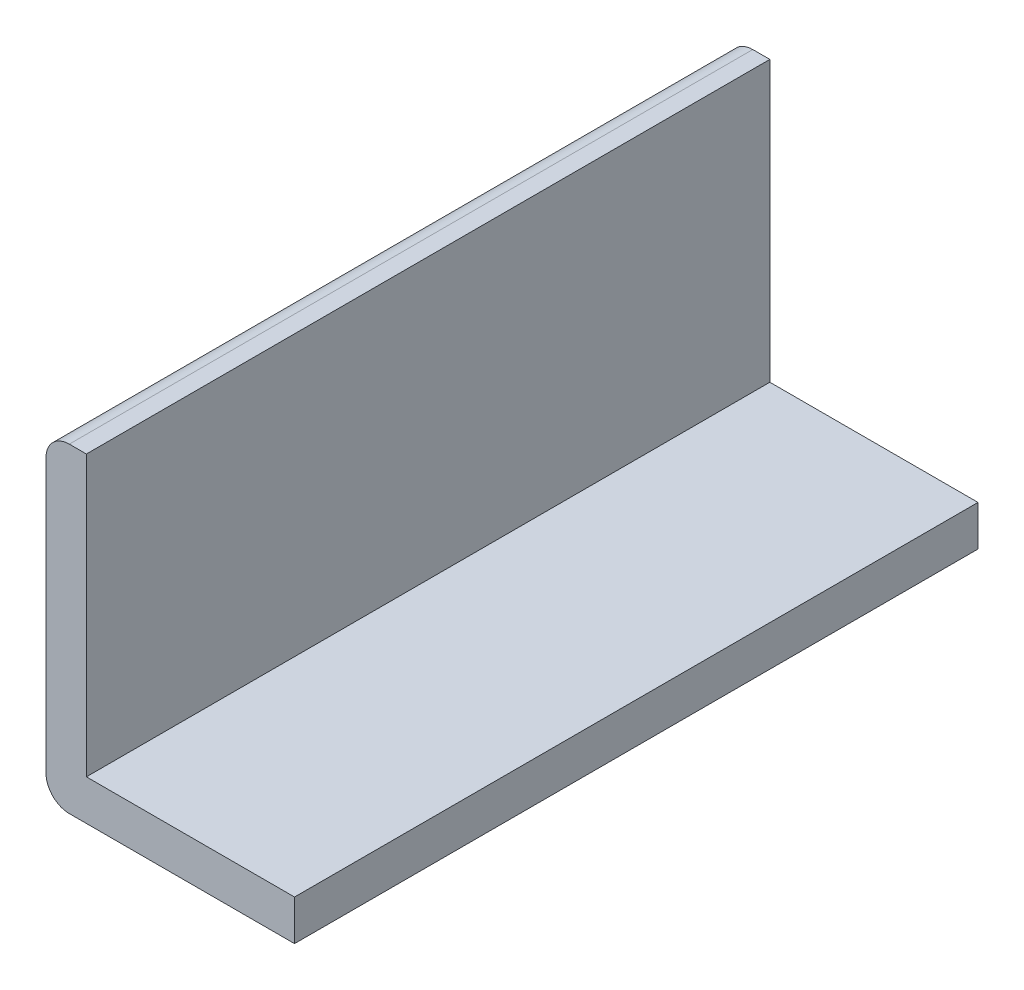
ISO-10303-21;
HEADER;
FILE_DESCRIPTION(('STEP AP214'),'2;1');
FILE_NAME('part.step','',(''),(''),'','','');
FILE_SCHEMA(('AUTOMOTIVE_DESIGN { 1 0 10303 214 1 1 1 1 }'));
ENDSEC;
DATA;
#1=APPLICATION_CONTEXT('core data for automotive mechanical design processes');
#2=APPLICATION_PROTOCOL_DEFINITION('international standard','automotive_design',2000,#1);
#3=PRODUCT_CONTEXT('',#1,'mechanical');
#4=PRODUCT('Part','Part','',(#3));
#5=PRODUCT_RELATED_PRODUCT_CATEGORY('part','',(#4));
#6=PRODUCT_DEFINITION_FORMATION('','',#4);
#7=PRODUCT_DEFINITION_CONTEXT('part definition',#1,'design');
#8=PRODUCT_DEFINITION('design','',#6,#7);
#9=PRODUCT_DEFINITION_SHAPE('','',#8);
#10=(LENGTH_UNIT() NAMED_UNIT(*) SI_UNIT(.MILLI.,.METRE.));
#11=(NAMED_UNIT(*) PLANE_ANGLE_UNIT() SI_UNIT($,.RADIAN.));
#12=(NAMED_UNIT(*) SI_UNIT($,.STERADIAN.) SOLID_ANGLE_UNIT());
#13=UNCERTAINTY_MEASURE_WITH_UNIT(LENGTH_MEASURE(1.E-05),#10,'distance_accuracy_value','');
#14=(GEOMETRIC_REPRESENTATION_CONTEXT(3) GLOBAL_UNCERTAINTY_ASSIGNED_CONTEXT((#13)) GLOBAL_UNIT_ASSIGNED_CONTEXT((#10,
#11,#12)) REPRESENTATION_CONTEXT('',''));
#15=CARTESIAN_POINT('',(0.,0.,0.));
#16=DIRECTION('',(0.,0.,1.));
#17=DIRECTION('',(1.,0.,0.));
#18=AXIS2_PLACEMENT_3D('',#15,#16,#17);
#19=CARTESIAN_POINT('',(0.075,0.075,0.));
#20=DIRECTION('',(0.,0.,-1.));
#21=DIRECTION('',(-1.,0.,0.));
#22=AXIS2_PLACEMENT_3D('',#19,#20,#21);
#23=CYLINDRICAL_SURFACE('',#22,0.075);
#24=CARTESIAN_POINT('',(0.075,0.075,0.));
#25=DIRECTION('',(0.,0.,-1.));
#26=DIRECTION('',(-1.,0.,0.));
#27=AXIS2_PLACEMENT_3D('',#24,#25,#26);
#28=CIRCLE('',#27,0.075);
#29=CARTESIAN_POINT('',(0.075,0.,0.));
#30=VERTEX_POINT('',#29);
#31=CARTESIAN_POINT('',(0.,0.075,0.));
#32=VERTEX_POINT('',#31);
#33=EDGE_CURVE('E89',#30,#32,#28,.T.);
#34=ORIENTED_EDGE('',*,*,#33,.T.);
#35=DIRECTION('',(0.,0.,-1.));
#36=VECTOR('',#35,1.);
#37=CARTESIAN_POINT('',(0.,0.075,0.));
#38=LINE('',#37,#36);
#39=CARTESIAN_POINT('',(0.,0.075,-2.2));
#40=VERTEX_POINT('',#39);
#41=EDGE_CURVE('E93',#32,#40,#38,.T.);
#42=ORIENTED_EDGE('',*,*,#41,.T.);
#43=CARTESIAN_POINT('',(0.075,0.075,-2.2));
#44=DIRECTION('',(0.,0.,-1.));
#45=DIRECTION('',(-1.,0.,0.));
#46=AXIS2_PLACEMENT_3D('',#43,#44,#45);
#47=CIRCLE('',#46,0.075);
#48=CARTESIAN_POINT('',(0.075,0.,-2.2));
#49=VERTEX_POINT('',#48);
#50=EDGE_CURVE('E20',#40,#49,#47,.F.);
#51=ORIENTED_EDGE('',*,*,#50,.T.);
#52=DIRECTION('',(0.,0.,-1.));
#53=VECTOR('',#52,1.);
#54=CARTESIAN_POINT('',(0.075,0.,0.));
#55=LINE('',#54,#53);
#56=EDGE_CURVE('E112',#30,#49,#55,.T.);
#57=ORIENTED_EDGE('',*,*,#56,.F.);
#58=EDGE_LOOP('',(#34,#42,#51,#57));
#59=FACE_BOUND('',#58,.T.);
#60=ADVANCED_FACE('F17',(#59),#23,.T.);
#61=CARTESIAN_POINT('',(0.,1.03,0.));
#62=DIRECTION('',(1.,0.,0.));
#63=DIRECTION('',(0.,0.,-1.));
#64=AXIS2_PLACEMENT_3D('',#61,#62,#63);
#65=PLANE('',#64);
#66=DIRECTION('',(0.,0.,1.));
#67=VECTOR('',#66,1.);
#68=CARTESIAN_POINT('',(0.,0.955,0.));
#69=LINE('',#68,#67);
#70=CARTESIAN_POINT('',(0.,0.955,-2.2));
#71=VERTEX_POINT('',#70);
#72=CARTESIAN_POINT('',(0.,0.955,0.));
#73=VERTEX_POINT('',#72);
#74=EDGE_CURVE('E96',#71,#73,#69,.T.);
#75=ORIENTED_EDGE('',*,*,#74,.F.);
#76=DIRECTION('',(0.,1.,0.));
#77=VECTOR('',#76,1.);
#78=CARTESIAN_POINT('',(0.,1.03,-2.2));
#79=LINE('',#78,#77);
#80=EDGE_CURVE('E81',#40,#71,#79,.T.);
#81=ORIENTED_EDGE('',*,*,#80,.F.);
#82=ORIENTED_EDGE('',*,*,#41,.F.);
#83=DIRECTION('',(0.,1.,0.));
#84=VECTOR('',#83,1.);
#85=CARTESIAN_POINT('',(0.,1.03,0.));
#86=LINE('',#85,#84);
#87=EDGE_CURVE('E97',#73,#32,#86,.F.);
#88=ORIENTED_EDGE('',*,*,#87,.F.);
#89=EDGE_LOOP('',(#75,#81,#82,#88));
#90=FACE_BOUND('',#89,.T.);
#91=ADVANCED_FACE('F92',(#90),#65,.F.);
#92=CARTESIAN_POINT('',(0.,0.,0.));
#93=DIRECTION('',(0.,-1.,0.));
#94=DIRECTION('',(0.,0.,-1.));
#95=AXIS2_PLACEMENT_3D('',#92,#93,#94);
#96=PLANE('',#95);
#97=DIRECTION('',(1.,0.,0.));
#98=VECTOR('',#97,1.);
#99=CARTESIAN_POINT('',(0.,0.,-2.2));
#100=LINE('',#99,#98);
#101=CARTESIAN_POINT('',(0.8,0.,-2.2));
#102=VERTEX_POINT('',#101);
#103=EDGE_CURVE('E84',#49,#102,#100,.T.);
#104=ORIENTED_EDGE('',*,*,#103,.T.);
#105=DIRECTION('',(0.,0.,1.));
#106=VECTOR('',#105,1.);
#107=CARTESIAN_POINT('',(0.8,0.,0.));
#108=LINE('',#107,#106);
#109=CARTESIAN_POINT('',(0.8,0.,0.));
#110=VERTEX_POINT('',#109);
#111=EDGE_CURVE('E107',#102,#110,#108,.T.);
#112=ORIENTED_EDGE('',*,*,#111,.T.);
#113=DIRECTION('',(1.,0.,0.));
#114=VECTOR('',#113,1.);
#115=CARTESIAN_POINT('',(0.,0.,0.));
#116=LINE('',#115,#114);
#117=EDGE_CURVE('E117',#110,#30,#116,.F.);
#118=ORIENTED_EDGE('',*,*,#117,.T.);
#119=ORIENTED_EDGE('',*,*,#56,.T.);
#120=EDGE_LOOP('',(#104,#112,#118,#119));
#121=FACE_BOUND('',#120,.T.);
#122=ADVANCED_FACE('F201',(#121),#96,.T.);
#123=CARTESIAN_POINT('',(0.075,0.955,0.));
#124=DIRECTION('',(0.,0.,1.));
#125=DIRECTION('',(1.,0.,0.));
#126=AXIS2_PLACEMENT_3D('',#123,#124,#125);
#127=CYLINDRICAL_SURFACE('',#126,0.075);
#128=CARTESIAN_POINT('',(0.075,0.955,0.));
#129=DIRECTION('',(0.,0.,1.));
#130=DIRECTION('',(1.,0.,0.));
#131=AXIS2_PLACEMENT_3D('',#128,#129,#130);
#132=CIRCLE('',#131,0.075);
#133=CARTESIAN_POINT('',(0.075,1.03,0.));
#134=VERTEX_POINT('',#133);
#135=EDGE_CURVE('E105',#73,#134,#132,.F.);
#136=ORIENTED_EDGE('',*,*,#135,.T.);
#137=DIRECTION('',(0.,0.,-1.));
#138=VECTOR('',#137,1.);
#139=CARTESIAN_POINT('',(0.075,1.03,0.));
#140=LINE('',#139,#138);
#141=CARTESIAN_POINT('',(0.075,1.03,-2.2));
#142=VERTEX_POINT('',#141);
#143=EDGE_CURVE('E129',#134,#142,#140,.T.);
#144=ORIENTED_EDGE('',*,*,#143,.T.);
#145=CARTESIAN_POINT('',(0.075,0.955,-2.2));
#146=DIRECTION('',(0.,0.,1.));
#147=DIRECTION('',(1.,0.,0.));
#148=AXIS2_PLACEMENT_3D('',#145,#146,#147);
#149=CIRCLE('',#148,0.075);
#150=EDGE_CURVE('E108',#142,#71,#149,.T.);
#151=ORIENTED_EDGE('',*,*,#150,.T.);
#152=ORIENTED_EDGE('',*,*,#74,.T.);
#153=EDGE_LOOP('',(#136,#144,#151,#152));
#154=FACE_BOUND('',#153,.T.);
#155=ADVANCED_FACE('F159',(#154),#127,.T.);
#156=CARTESIAN_POINT('',(0.8,1.03,0.));
#157=DIRECTION('',(-1.,0.,0.));
#158=DIRECTION('',(0.,0.,1.));
#159=AXIS2_PLACEMENT_3D('',#156,#157,#158);
#160=PLANE('',#159);
#161=DIRECTION('',(0.,0.,-1.));
#162=VECTOR('',#161,1.);
#163=CARTESIAN_POINT('',(0.8,0.13,-2.2));
#164=LINE('',#163,#162);
#165=CARTESIAN_POINT('',(0.8,0.13,-2.2));
#166=VERTEX_POINT('',#165);
#167=CARTESIAN_POINT('',(0.8,0.13,0.));
#168=VERTEX_POINT('',#167);
#169=EDGE_CURVE('E164',#166,#168,#164,.F.);
#170=ORIENTED_EDGE('',*,*,#169,.T.);
#171=DIRECTION('',(0.,1.,0.));
#172=VECTOR('',#171,1.);
#173=CARTESIAN_POINT('',(0.8,1.03,0.));
#174=LINE('',#173,#172);
#175=EDGE_CURVE('E123',#110,#168,#174,.T.);
#176=ORIENTED_EDGE('',*,*,#175,.F.);
#177=ORIENTED_EDGE('',*,*,#111,.F.);
#178=DIRECTION('',(0.,1.,0.));
#179=VECTOR('',#178,1.);
#180=CARTESIAN_POINT('',(0.8,1.03,-2.2));
#181=LINE('',#180,#179);
#182=EDGE_CURVE('E126',#102,#166,#181,.T.);
#183=ORIENTED_EDGE('',*,*,#182,.T.);
#184=EDGE_LOOP('',(#170,#176,#177,#183));
#185=FACE_BOUND('',#184,.T.);
#186=ADVANCED_FACE('F195',(#185),#160,.F.);
#187=CARTESIAN_POINT('',(0.,1.03,0.));
#188=DIRECTION('',(0.,-1.,0.));
#189=DIRECTION('',(0.,0.,-1.));
#190=AXIS2_PLACEMENT_3D('',#187,#188,#189);
#191=PLANE('',#190);
#192=ORIENTED_EDGE('',*,*,#143,.F.);
#193=DIRECTION('',(-1.,0.,0.));
#194=VECTOR('',#193,1.);
#195=CARTESIAN_POINT('',(0.,1.03,0.));
#196=LINE('',#195,#194);
#197=CARTESIAN_POINT('',(0.13,1.03,0.));
#198=VERTEX_POINT('',#197);
#199=EDGE_CURVE('E147',#134,#198,#196,.F.);
#200=ORIENTED_EDGE('',*,*,#199,.T.);
#201=DIRECTION('',(0.,0.,1.));
#202=VECTOR('',#201,1.);
#203=CARTESIAN_POINT('',(0.13,1.03,-2.2));
#204=LINE('',#203,#202);
#205=CARTESIAN_POINT('',(0.13,1.03,-2.2));
#206=VERTEX_POINT('',#205);
#207=EDGE_CURVE('E143',#198,#206,#204,.F.);
#208=ORIENTED_EDGE('',*,*,#207,.T.);
#209=DIRECTION('',(1.,0.,0.));
#210=VECTOR('',#209,1.);
#211=CARTESIAN_POINT('',(0.,1.03,-2.2));
#212=LINE('',#211,#210);
#213=EDGE_CURVE('E128',#206,#142,#212,.F.);
#214=ORIENTED_EDGE('',*,*,#213,.T.);
#215=EDGE_LOOP('',(#192,#200,#208,#214));
#216=FACE_BOUND('',#215,.T.);
#217=ADVANCED_FACE('F162',(#216),#191,.F.);
#218=CARTESIAN_POINT('',(0.,1.03,-2.2));
#219=DIRECTION('',(0.,0.,1.));
#220=DIRECTION('',(1.,0.,0.));
#221=AXIS2_PLACEMENT_3D('',#218,#219,#220);
#222=PLANE('',#221);
#223=ORIENTED_EDGE('',*,*,#150,.F.);
#224=ORIENTED_EDGE('',*,*,#213,.F.);
#225=DIRECTION('',(0.,-1.,0.));
#226=VECTOR('',#225,1.);
#227=CARTESIAN_POINT('',(0.13,1.03,-2.2));
#228=LINE('',#227,#226);
#229=CARTESIAN_POINT('',(0.13,0.13,-2.2));
#230=VERTEX_POINT('',#229);
#231=EDGE_CURVE('E146',#206,#230,#228,.T.);
#232=ORIENTED_EDGE('',*,*,#231,.T.);
#233=DIRECTION('',(1.,0.,0.));
#234=VECTOR('',#233,1.);
#235=CARTESIAN_POINT('',(0.13,0.13,-2.2));
#236=LINE('',#235,#234);
#237=EDGE_CURVE('E171',#230,#166,#236,.T.);
#238=ORIENTED_EDGE('',*,*,#237,.T.);
#239=ORIENTED_EDGE('',*,*,#182,.F.);
#240=ORIENTED_EDGE('',*,*,#103,.F.);
#241=ORIENTED_EDGE('',*,*,#50,.F.);
#242=ORIENTED_EDGE('',*,*,#80,.T.);
#243=EDGE_LOOP('',(#223,#224,#232,#238,#239,#240,#241,#242));
#244=FACE_BOUND('',#243,.T.);
#245=ADVANCED_FACE('F80',(#244),#222,.F.);
#246=CARTESIAN_POINT('',(0.13,0.13,-2.2));
#247=DIRECTION('',(0.,-1.,0.));
#248=DIRECTION('',(0.,0.,-1.));
#249=AXIS2_PLACEMENT_3D('',#246,#247,#248);
#250=PLANE('',#249);
#251=ORIENTED_EDGE('',*,*,#169,.F.);
#252=ORIENTED_EDGE('',*,*,#237,.F.);
#253=DIRECTION('',(0.,0.,1.));
#254=VECTOR('',#253,1.);
#255=CARTESIAN_POINT('',(0.13,0.13,-2.2));
#256=LINE('',#255,#254);
#257=CARTESIAN_POINT('',(0.13,0.13,0.));
#258=VERTEX_POINT('',#257);
#259=EDGE_CURVE('E26',#230,#258,#256,.T.);
#260=ORIENTED_EDGE('',*,*,#259,.T.);
#261=DIRECTION('',(-1.,0.,0.));
#262=VECTOR('',#261,1.);
#263=CARTESIAN_POINT('',(0.,0.13,0.));
#264=LINE('',#263,#262);
#265=EDGE_CURVE('E34',#258,#168,#264,.F.);
#266=ORIENTED_EDGE('',*,*,#265,.T.);
#267=EDGE_LOOP('',(#251,#252,#260,#266));
#268=FACE_BOUND('',#267,.T.);
#269=ADVANCED_FACE('F178',(#268),#250,.F.);
#270=CARTESIAN_POINT('',(0.,1.03,0.));
#271=DIRECTION('',(0.,0.,-1.));
#272=DIRECTION('',(-1.,0.,0.));
#273=AXIS2_PLACEMENT_3D('',#270,#271,#272);
#274=PLANE('',#273);
#275=ORIENTED_EDGE('',*,*,#135,.F.);
#276=ORIENTED_EDGE('',*,*,#87,.T.);
#277=ORIENTED_EDGE('',*,*,#33,.F.);
#278=ORIENTED_EDGE('',*,*,#117,.F.);
#279=ORIENTED_EDGE('',*,*,#175,.T.);
#280=ORIENTED_EDGE('',*,*,#265,.F.);
#281=DIRECTION('',(0.,-1.,0.));
#282=VECTOR('',#281,1.);
#283=CARTESIAN_POINT('',(0.13,1.03,0.));
#284=LINE('',#283,#282);
#285=EDGE_CURVE('E11',#258,#198,#284,.F.);
#286=ORIENTED_EDGE('',*,*,#285,.T.);
#287=ORIENTED_EDGE('',*,*,#199,.F.);
#288=EDGE_LOOP('',(#275,#276,#277,#278,#279,#280,#286,#287));
#289=FACE_BOUND('',#288,.T.);
#290=ADVANCED_FACE('F157',(#289),#274,.F.);
#291=CARTESIAN_POINT('',(0.13,1.03,-2.2));
#292=DIRECTION('',(-1.,0.,0.));
#293=DIRECTION('',(0.,-1.,0.));
#294=AXIS2_PLACEMENT_3D('',#291,#292,#293);
#295=PLANE('',#294);
#296=ORIENTED_EDGE('',*,*,#259,.F.);
#297=ORIENTED_EDGE('',*,*,#231,.F.);
#298=ORIENTED_EDGE('',*,*,#207,.F.);
#299=ORIENTED_EDGE('',*,*,#285,.F.);
#300=EDGE_LOOP('',(#296,#297,#298,#299));
#301=FACE_BOUND('',#300,.T.);
#302=ADVANCED_FACE('F180',(#301),#295,.F.);
#303=CLOSED_SHELL('',(#60,#91,#122,#155,#186,#217,#245,#269,#290,#302));
#304=MANIFOLD_SOLID_BREP('B1',#303);
#305=ADVANCED_BREP_SHAPE_REPRESENTATION('',(#18,#304),#14);
#306=SHAPE_DEFINITION_REPRESENTATION(#9,#305);
ENDSEC;
END-ISO-10303-21;
